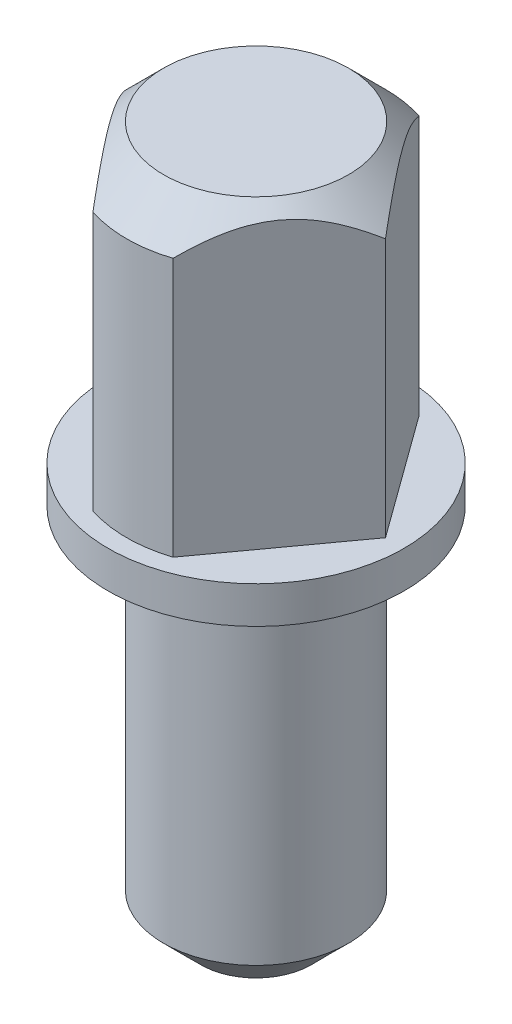
ISO-10303-21;
HEADER;
FILE_DESCRIPTION(('STEP AP214'),'2;1');
FILE_NAME('part.step','',(''),(''),'','','');
FILE_SCHEMA(('AUTOMOTIVE_DESIGN { 1 0 10303 214 1 1 1 1 }'));
ENDSEC;
DATA;
#1=APPLICATION_CONTEXT('core data for automotive mechanical design processes');
#2=APPLICATION_PROTOCOL_DEFINITION('international standard','automotive_design',2000,#1);
#3=PRODUCT_CONTEXT('',#1,'mechanical');
#4=PRODUCT('Part','Part','',(#3));
#5=PRODUCT_RELATED_PRODUCT_CATEGORY('part','',(#4));
#6=PRODUCT_DEFINITION_FORMATION('','',#4);
#7=PRODUCT_DEFINITION_CONTEXT('part definition',#1,'design');
#8=PRODUCT_DEFINITION('design','',#6,#7);
#9=PRODUCT_DEFINITION_SHAPE('','',#8);
#10=(LENGTH_UNIT() NAMED_UNIT(*) SI_UNIT(.MILLI.,.METRE.));
#11=(NAMED_UNIT(*) PLANE_ANGLE_UNIT() SI_UNIT($,.RADIAN.));
#12=(NAMED_UNIT(*) SI_UNIT($,.STERADIAN.) SOLID_ANGLE_UNIT());
#13=UNCERTAINTY_MEASURE_WITH_UNIT(LENGTH_MEASURE(1.E-05),#10,'distance_accuracy_value','');
#14=(GEOMETRIC_REPRESENTATION_CONTEXT(3) GLOBAL_UNCERTAINTY_ASSIGNED_CONTEXT((#13)) GLOBAL_UNIT_ASSIGNED_CONTEXT((#10,
#11,#12)) REPRESENTATION_CONTEXT('',''));
#15=CARTESIAN_POINT('',(0.,0.,0.));
#16=DIRECTION('',(0.,0.,1.));
#17=DIRECTION('',(1.,0.,0.));
#18=AXIS2_PLACEMENT_3D('',#15,#16,#17);
#19=CARTESIAN_POINT('',(0.,18.,0.));
#20=DIRECTION('',(0.,-1.,0.));
#21=DIRECTION('',(0.,0.,-1.));
#22=AXIS2_PLACEMENT_3D('',#19,#20,#21);
#23=CONICAL_SURFACE('',#22,3.5,0.785398163397448);
#24=CARTESIAN_POINT('',(0.,19.,0.));
#25=DIRECTION('',(0.,-1.,0.));
#26=DIRECTION('',(0.,0.,-1.));
#27=AXIS2_PLACEMENT_3D('',#24,#25,#26);
#28=CIRCLE('',#27,2.5);
#29=CARTESIAN_POINT('',(0.,19.,-2.5));
#30=VERTEX_POINT('',#29);
#31=EDGE_CURVE('E11',#30,#30,#28,.T.);
#32=ORIENTED_EDGE('',*,*,#31,.T.);
#33=EDGE_LOOP('',(#32));
#34=FACE_BOUND('',#33,.T.);
#35=CARTESIAN_POINT('',(0.,18.,0.));
#36=DIRECTION('',(0.,-1.,0.));
#37=DIRECTION('',(0.,0.,-1.));
#38=AXIS2_PLACEMENT_3D('',#35,#36,#37);
#39=CIRCLE('',#38,3.5);
#40=CARTESIAN_POINT('',(-1.0838503128378,18.,-3.32795259872514));
#41=VERTEX_POINT('',#40);
#42=CARTESIAN_POINT('',(1.0838503128378,18.,-3.32795259872514));
#43=VERTEX_POINT('',#42);
#44=EDGE_CURVE('E164',#41,#43,#39,.T.);
#45=ORIENTED_EDGE('',*,*,#44,.F.);
#46=CARTESIAN_POINT('',(-1.08365032367699,17.9998,-3.32822805949273));
#47=CARTESIAN_POINT('',(-1.11402671820043,18.030176357857,-3.28638826718544));
#48=CARTESIAN_POINT('',(-1.14459355594848,18.0600000576309,-3.24428616247772));
#49=CARTESIAN_POINT('',(-1.20615098634006,18.1183831901649,-3.15949828218579));
#50=CARTESIAN_POINT('',(-1.23714168574156,18.1469422964405,-3.11681235955545));
#51=CARTESIAN_POINT('',(-1.33103028730438,18.230675096118,-2.98749221965607));
#52=CARTESIAN_POINT('',(-1.39461173325774,18.2836681541312,-2.89991650387344));
#53=CARTESIAN_POINT('',(-1.52481008307131,18.3828455712695,-2.7205840978913));
#54=CARTESIAN_POINT('',(-1.59145903350211,18.4289094633328,-2.6287832674349));
#55=CARTESIAN_POINT('',(-1.72683225313013,18.5107954289209,-2.44232310710105));
#56=CARTESIAN_POINT('',(-1.79555308134463,18.5466335500756,-2.34766851675916));
#57=CARTESIAN_POINT('',(-1.9138220505311,18.5966405651253,-2.18476738300741));
#58=CARTESIAN_POINT('',(-1.96289168610165,18.6140849866464,-2.11717992264302));
#59=CARTESIAN_POINT('',(-2.06172783818495,18.6419607201251,-1.98104513309697));
#60=CARTESIAN_POINT('',(-2.11149436899897,18.6523918879448,-1.91249778421702));
#61=CARTESIAN_POINT('',(-2.21096761842672,18.6656280350204,-1.77548547049505));
#62=CARTESIAN_POINT('',(-2.26067144186041,18.6684952340286,-1.70702449341171));
#63=CARTESIAN_POINT('',(-2.36002762937955,18.6666229438029,-1.57017341824422));
#64=CARTESIAN_POINT('',(-2.40967999452048,18.6618836138081,-1.50178331870628));
#65=CARTESIAN_POINT('',(-2.5084002871059,18.6450860663779,-1.36580811154002));
#66=CARTESIAN_POINT('',(-2.55746951812905,18.6330497749663,-1.29822120839052));
#67=CARTESIAN_POINT('',(-2.65486740196593,18.6022887739095,-1.16406745858457));
#68=CARTESIAN_POINT('',(-2.70319597497211,18.5835633487067,-1.09750072185334));
#69=CARTESIAN_POINT('',(-2.84747314260307,18.5182406027486,-0.898776455097289));
#70=CARTESIAN_POINT('',(-2.94203464472195,18.4626310893466,-0.768529476448589));
#71=CARTESIAN_POINT('',(-3.07497981712026,18.3704275830071,-0.585413656132604));
#72=CARTESIAN_POINT('',(-3.11511985862376,18.3406664105703,-0.53012562652736));
#73=CARTESIAN_POINT('',(-3.1946539651854,18.2783398341906,-0.420577059223999));
#74=CARTESIAN_POINT('',(-3.23404799847801,18.2457743111626,-0.366316565279024));
#75=CARTESIAN_POINT('',(-3.31159194072944,18.1787363797435,-0.25950920748071));
#76=CARTESIAN_POINT('',(-3.34975148210584,18.1442959064636,-0.206949076142614));
#77=CARTESIAN_POINT('',(-3.42541823684559,18.073460794432,-0.102727316037591));
#78=CARTESIAN_POINT('',(-3.46292573434717,18.037067036627,-0.0510652959047807));
#79=CARTESIAN_POINT('',(-3.50014520337147,17.9998547909145,0.000199999999999133));
#80=B_SPLINE_CURVE_WITH_KNOTS('',3,(#46,#47,#48,#49,#50,#51,#52,#53,#54,#55,#56,#57,#58,#59,#60,
#61,#62,#63,#64,#65,#66,#67,#68,#69,#70,#71,#72,#73,#74,#75,#76,#77,#78,#79),.UNSPECIFIED.,.F.,
.F.,(4,2,2,2,2,2,2,2,2,2,2,2,2,2,2,2,4),(0.,0.179893726946961,0.35983363009338,
0.721096328039957,1.0880525124209,1.45442961293632,1.71014372990977,1.96586310221305,
2.21947232080014,2.47307623026548,2.72592185782533,2.97879454118124,3.48799252225676,
3.71154163700335,3.93510024931077,4.15562021370233,4.3760415442346),.UNSPECIFIED.);
#81=CARTESIAN_POINT('',(-3.5,18.,0.));
#82=VERTEX_POINT('',#81);
#83=EDGE_CURVE('E178',#41,#82,#80,.T.);
#84=ORIENTED_EDGE('',*,*,#83,.T.);
#85=CARTESIAN_POINT('',(-3.50014520337147,17.9998547909145,-0.000199999999999552));
#86=CARTESIAN_POINT('',(-3.46976917038442,18.0302298853187,0.0416392943348437));
#87=CARTESIAN_POINT('',(-3.43920269245051,18.0600523001882,0.0837409034423182));
#88=CARTESIAN_POINT('',(-3.37764597959783,18.1184328159192,0.168527795411605));
#89=CARTESIAN_POINT('',(-3.34665563791303,18.1469905902605,0.211213225330655));
#90=CARTESIAN_POINT('',(-3.2527681083358,18.230719310099,0.340531888700142));
#91=CARTESIAN_POINT('',(-3.18918737682792,18.2837095416669,0.428106620420938));
#92=CARTESIAN_POINT('',(-3.05899069461434,18.3828808807531,0.607436729486728));
#93=CARTESIAN_POINT('',(-2.99234270399167,18.4289415404428,0.699236237924062));
#94=CARTESIAN_POINT('',(-2.85697151581384,18.5108208980495,0.885693600182132));
#95=CARTESIAN_POINT('',(-2.78825175914587,18.5466556441986,0.980346714598868));
#96=CARTESIAN_POINT('',(-2.66998380031396,18.5966573612182,1.14324645670998));
#97=CARTESIAN_POINT('',(-2.62091403752326,18.6140997287698,1.21083409230467));
#98=CARTESIAN_POINT('',(-2.52207772015824,18.6419711770728,1.34696910950623));
#99=CARTESIAN_POINT('',(-2.47231115127602,18.6524001135976,1.41551651082048));
#100=CARTESIAN_POINT('',(-2.37283791139977,18.6656317458405,1.55252881138641));
#101=CARTESIAN_POINT('',(-2.32313413440752,18.6684966572558,1.62098972450232));
#102=CARTESIAN_POINT('',(-2.22377816016952,18.6666198363976,1.75784050590095));
#103=CARTESIAN_POINT('',(-2.17412596186682,18.6618782632029,1.82623037563952));
#104=CARTESIAN_POINT('',(-2.07540619869302,18.6450764159923,1.96220485360558));
#105=CARTESIAN_POINT('',(-2.02633732912341,18.6330380810804,2.02979125889676));
#106=CARTESIAN_POINT('',(-1.92894023605284,18.6022732575745,2.1639439195182));
#107=CARTESIAN_POINT('',(-1.88061209235966,18.5835460535138,2.23051006492295));
#108=CARTESIAN_POINT('',(-1.73633628349655,18.5182184012655,2.4292324601414));
#109=CARTESIAN_POINT('',(-1.64177576259625,18.4626062183854,2.55947808728073));
#110=CARTESIAN_POINT('',(-1.50883010552235,18.370398335446,2.74259457517845));
#111=CARTESIAN_POINT('',(-1.46868867439683,18.3406348977689,2.79788451881916));
#112=CARTESIAN_POINT('',(-1.38915183530266,18.2783037250935,2.90743684985404));
#113=CARTESIAN_POINT('',(-1.34975645912268,18.2457358709283,2.96169919346319));
#114=CARTESIAN_POINT('',(-1.27220989398372,18.1786932798204,3.06851016397037));
#115=CARTESIAN_POINT('',(-1.23404907196244,18.1442504789972,3.12107205924117));
#116=CARTESIAN_POINT('',(-1.15837978468645,18.0734106947299,3.22529730760713));
#117=CARTESIAN_POINT('',(-1.12087103525992,18.0370145923077,3.27696105211443));
#118=CARTESIAN_POINT('',(-1.08365032367699,17.9998,3.32822805949273));
#119=B_SPLINE_CURVE_WITH_KNOTS('',3,(#85,#86,#87,#88,#89,#90,#91,#92,#93,#94,#95,#96,#97,#98,
#99,#100,#101,#102,#103,#104,#105,#106,#107,#108,#109,#110,#111,#112,#113,#114,#115,#116,#117,
#118),.UNSPECIFIED.,.F.,.F.,(4,2,2,2,2,2,2,2,2,2,2,2,2,2,2,2,4),(0.,0.179890214712517,
0.359826608032367,0.721082283619987,1.08803025996694,1.45439915201837,1.71011263032279,
1.96583136705195,2.21944011442345,2.47304355799737,2.72588825098435,2.97875999729758,
3.48795602073635,3.71151435191345,3.93508218735297,4.15561120043553,4.37604156812719),.UNSPECIFIED.);
#120=CARTESIAN_POINT('',(-1.0838503128378,18.,3.32795259872514));
#121=VERTEX_POINT('',#120);
#122=EDGE_CURVE('E177',#82,#121,#119,.T.);
#123=ORIENTED_EDGE('',*,*,#122,.T.);
#124=CARTESIAN_POINT('',(1.0838503128378,18.,3.32795259872514));
#125=VERTEX_POINT('',#124);
#126=EDGE_CURVE('E40',#125,#121,#39,.T.);
#127=ORIENTED_EDGE('',*,*,#126,.F.);
#128=CARTESIAN_POINT('',(1.08365032367699,17.9998,3.32822805949273));
#129=CARTESIAN_POINT('',(1.11402671820043,18.030176357857,3.28638826718544));
#130=CARTESIAN_POINT('',(1.14459355594848,18.0600000576309,3.24428616247772));
#131=CARTESIAN_POINT('',(1.20615098634006,18.1183831901649,3.15949828218579));
#132=CARTESIAN_POINT('',(1.23714168574156,18.1469422964405,3.11681235955545));
#133=CARTESIAN_POINT('',(1.33103028730438,18.230675096118,2.98749221965607));
#134=CARTESIAN_POINT('',(1.39461173325774,18.2836681541312,2.89991650387344));
#135=CARTESIAN_POINT('',(1.52481008307131,18.3828455712695,2.7205840978913));
#136=CARTESIAN_POINT('',(1.59145903350211,18.4289094633328,2.6287832674349));
#137=CARTESIAN_POINT('',(1.72683225313013,18.5107954289209,2.44232310710105));
#138=CARTESIAN_POINT('',(1.79555308134463,18.5466335500756,2.34766851675916));
#139=CARTESIAN_POINT('',(1.9138220505311,18.5966405651253,2.18476738300741));
#140=CARTESIAN_POINT('',(1.96289168610165,18.6140849866464,2.11717992264302));
#141=CARTESIAN_POINT('',(2.06172783818495,18.6419607201251,1.98104513309697));
#142=CARTESIAN_POINT('',(2.11149436899897,18.6523918879448,1.91249778421702));
#143=CARTESIAN_POINT('',(2.21096761842672,18.6656280350204,1.77548547049505));
#144=CARTESIAN_POINT('',(2.26067144186041,18.6684952340286,1.70702449341171));
#145=CARTESIAN_POINT('',(2.36002762937955,18.6666229438029,1.57017341824422));
#146=CARTESIAN_POINT('',(2.40967999452048,18.6618836138081,1.50178331870628));
#147=CARTESIAN_POINT('',(2.5084002871059,18.6450860663779,1.36580811154002));
#148=CARTESIAN_POINT('',(2.55746951812905,18.6330497749663,1.29822120839052));
#149=CARTESIAN_POINT('',(2.65486740196593,18.6022887739095,1.16406745858457));
#150=CARTESIAN_POINT('',(2.70319597497211,18.5835633487067,1.09750072185334));
#151=CARTESIAN_POINT('',(2.84747314260307,18.5182406027486,0.898776455097287));
#152=CARTESIAN_POINT('',(2.94203464472195,18.4626310893466,0.768529476448588));
#153=CARTESIAN_POINT('',(3.07497981712026,18.3704275830071,0.585413656132604));
#154=CARTESIAN_POINT('',(3.11511985862376,18.3406664105703,0.53012562652736));
#155=CARTESIAN_POINT('',(3.1946539651854,18.2783398341906,0.420577059223999));
#156=CARTESIAN_POINT('',(3.23404799847801,18.2457743111626,0.366316565279024));
#157=CARTESIAN_POINT('',(3.31159194072944,18.1787363797435,0.259509207480709));
#158=CARTESIAN_POINT('',(3.34975148210584,18.1442959064636,0.206949076142613));
#159=CARTESIAN_POINT('',(3.42541823684559,18.073460794432,0.102727316037591));
#160=CARTESIAN_POINT('',(3.46292573434717,18.037067036627,0.0510652959047807));
#161=CARTESIAN_POINT('',(3.50014520337147,17.9998547909145,-0.000199999999999083));
#162=B_SPLINE_CURVE_WITH_KNOTS('',3,(#128,#129,#130,#131,#132,#133,#134,#135,#136,#137,#138,
#139,#140,#141,#142,#143,#144,#145,#146,#147,#148,#149,#150,#151,#152,#153,#154,#155,#156,#157,
#158,#159,#160,#161),.UNSPECIFIED.,.F.,.F.,(4,2,2,2,2,2,2,2,2,2,2,2,2,2,2,2,4),(0.,
0.179893726946961,0.359833630093378,0.721096328039957,1.0880525124209,1.45442961293632,
1.71014372990977,1.96586310221305,2.21947232080014,2.47307623026548,2.72592185782533,
2.97879454118124,3.48799252225676,3.71154163700335,3.93510024931077,4.15562021370233,
4.3760415442346),.UNSPECIFIED.);
#163=CARTESIAN_POINT('',(3.5,18.,0.));
#164=VERTEX_POINT('',#163);
#165=EDGE_CURVE('E175',#125,#164,#162,.T.);
#166=ORIENTED_EDGE('',*,*,#165,.T.);
#167=CARTESIAN_POINT('',(3.50014520337147,17.9998547909145,0.000199999999999693));
#168=CARTESIAN_POINT('',(3.46976917038442,18.0302298853187,-0.0416392943348438));
#169=CARTESIAN_POINT('',(3.43920269245051,18.0600523001882,-0.0837409034423184));
#170=CARTESIAN_POINT('',(3.37764597959783,18.1184328159192,-0.168527795411605));
#171=CARTESIAN_POINT('',(3.34665563791303,18.1469905902605,-0.211213225330656));
#172=CARTESIAN_POINT('',(3.2527681083358,18.230719310099,-0.340531888700142));
#173=CARTESIAN_POINT('',(3.18918737682792,18.2837095416669,-0.428106620420938));
#174=CARTESIAN_POINT('',(3.05899069461434,18.3828808807531,-0.607436729486728));
#175=CARTESIAN_POINT('',(2.99234270399167,18.4289415404428,-0.699236237924062));
#176=CARTESIAN_POINT('',(2.85697151581384,18.5108208980495,-0.885693600182132));
#177=CARTESIAN_POINT('',(2.78825175914587,18.5466556441986,-0.980346714598867));
#178=CARTESIAN_POINT('',(2.66998380031396,18.5966573612182,-1.14324645670998));
#179=CARTESIAN_POINT('',(2.62091403752326,18.6140997287698,-1.21083409230467));
#180=CARTESIAN_POINT('',(2.52207772015824,18.6419711770728,-1.34696910950622));
#181=CARTESIAN_POINT('',(2.47231115127602,18.6524001135976,-1.41551651082047));
#182=CARTESIAN_POINT('',(2.37283791139977,18.6656317458405,-1.55252881138641));
#183=CARTESIAN_POINT('',(2.32313413440752,18.6684966572558,-1.62098972450232));
#184=CARTESIAN_POINT('',(2.22377816016952,18.6666198363976,-1.75784050590095));
#185=CARTESIAN_POINT('',(2.17412596186682,18.6618782632029,-1.82623037563952));
#186=CARTESIAN_POINT('',(2.07540619869302,18.6450764159923,-1.96220485360558));
#187=CARTESIAN_POINT('',(2.02633732912341,18.6330380810804,-2.02979125889676));
#188=CARTESIAN_POINT('',(1.92894023605284,18.6022732575745,-2.1639439195182));
#189=CARTESIAN_POINT('',(1.88061209235966,18.5835460535138,-2.23051006492295));
#190=CARTESIAN_POINT('',(1.73633628349655,18.5182184012655,-2.4292324601414));
#191=CARTESIAN_POINT('',(1.64177576259625,18.4626062183854,-2.55947808728073));
#192=CARTESIAN_POINT('',(1.50883010552235,18.370398335446,-2.74259457517845));
#193=CARTESIAN_POINT('',(1.46868867439683,18.3406348977689,-2.79788451881916));
#194=CARTESIAN_POINT('',(1.38915183530266,18.2783037250935,-2.90743684985404));
#195=CARTESIAN_POINT('',(1.34975645912268,18.2457358709283,-2.96169919346319));
#196=CARTESIAN_POINT('',(1.27220989398372,18.1786932798204,-3.06851016397037));
#197=CARTESIAN_POINT('',(1.23404907196244,18.1442504789972,-3.12107205924117));
#198=CARTESIAN_POINT('',(1.15837978468645,18.0734106947299,-3.22529730760713));
#199=CARTESIAN_POINT('',(1.12087103525992,18.0370145923077,-3.27696105211443));
#200=CARTESIAN_POINT('',(1.08365032367699,17.9998,-3.32822805949273));
#201=B_SPLINE_CURVE_WITH_KNOTS('',3,(#167,#168,#169,#170,#171,#172,#173,#174,#175,#176,#177,
#178,#179,#180,#181,#182,#183,#184,#185,#186,#187,#188,#189,#190,#191,#192,#193,#194,#195,#196,
#197,#198,#199,#200),.UNSPECIFIED.,.F.,.F.,(4,2,2,2,2,2,2,2,2,2,2,2,2,2,2,2,4),(0.,
0.179890214712517,0.359826608032366,0.721082283619987,1.08803025996694,1.45439915201836,
1.71011263032278,1.96583136705194,2.21944011442345,2.47304355799737,2.72588825098435,
2.97875999729757,3.48795602073635,3.71151435191345,3.93508218735297,4.15561120043553,
4.37604156812719),.UNSPECIFIED.);
#202=EDGE_CURVE('E104',#164,#43,#201,.T.);
#203=ORIENTED_EDGE('',*,*,#202,.T.);
#204=EDGE_LOOP('',(#45,#84,#123,#127,#166,#203));
#205=FACE_BOUND('',#204,.T.);
#206=ADVANCED_FACE('F32',(#34,#205),#23,.T.);
#207=CARTESIAN_POINT('',(0.,0.,0.));
#208=DIRECTION('',(0.,-1.,0.));
#209=DIRECTION('',(0.,0.,-1.));
#210=AXIS2_PLACEMENT_3D('',#207,#208,#209);
#211=CYLINDRICAL_SURFACE('',#210,3.5);
#212=CARTESIAN_POINT('',(0.,11.,0.));
#213=DIRECTION('',(0.,-1.,0.));
#214=DIRECTION('',(0.,0.,-1.));
#215=AXIS2_PLACEMENT_3D('',#212,#213,#214);
#216=CIRCLE('',#215,3.5);
#217=CARTESIAN_POINT('',(-1.0838503128378,11.,-3.32795259872514));
#218=VERTEX_POINT('',#217);
#219=CARTESIAN_POINT('',(1.0838503128378,11.,-3.32795259872514));
#220=VERTEX_POINT('',#219);
#221=EDGE_CURVE('E87',#218,#220,#216,.T.);
#222=ORIENTED_EDGE('',*,*,#221,.F.);
#223=DIRECTION('',(0.,-1.,0.));
#224=VECTOR('',#223,1.);
#225=CARTESIAN_POINT('',(-1.0838503128378,0.,-3.32795259872514));
#226=LINE('',#225,#224);
#227=EDGE_CURVE('E159',#218,#41,#226,.F.);
#228=ORIENTED_EDGE('',*,*,#227,.T.);
#229=ORIENTED_EDGE('',*,*,#44,.T.);
#230=DIRECTION('',(0.,-1.,0.));
#231=VECTOR('',#230,1.);
#232=CARTESIAN_POINT('',(1.0838503128378,0.,-3.32795259872514));
#233=LINE('',#232,#231);
#234=EDGE_CURVE('E111',#43,#220,#233,.T.);
#235=ORIENTED_EDGE('',*,*,#234,.T.);
#236=EDGE_LOOP('',(#222,#228,#229,#235));
#237=FACE_BOUND('',#236,.T.);
#238=ADVANCED_FACE('F147',(#237),#211,.T.);
#239=ORIENTED_EDGE('',*,*,#126,.T.);
#240=DIRECTION('',(0.,-1.,0.));
#241=VECTOR('',#240,1.);
#242=CARTESIAN_POINT('',(-1.0838503128378,0.,3.32795259872514));
#243=LINE('',#242,#241);
#244=CARTESIAN_POINT('',(-1.0838503128378,11.,3.32795259872514));
#245=VERTEX_POINT('',#244);
#246=EDGE_CURVE('E172',#121,#245,#243,.T.);
#247=ORIENTED_EDGE('',*,*,#246,.T.);
#248=CARTESIAN_POINT('',(1.0838503128378,11.,3.32795259872514));
#249=VERTEX_POINT('',#248);
#250=EDGE_CURVE('E161',#249,#245,#216,.T.);
#251=ORIENTED_EDGE('',*,*,#250,.F.);
#252=DIRECTION('',(0.,-1.,0.));
#253=VECTOR('',#252,1.);
#254=CARTESIAN_POINT('',(1.0838503128378,0.,3.32795259872514));
#255=LINE('',#254,#253);
#256=EDGE_CURVE('E98',#249,#125,#255,.F.);
#257=ORIENTED_EDGE('',*,*,#256,.T.);
#258=EDGE_LOOP('',(#239,#247,#251,#257));
#259=FACE_BOUND('',#258,.T.);
#260=ADVANCED_FACE('F149',(#259),#211,.T.);
#261=CARTESIAN_POINT('',(1.5,0.,0.));
#262=DIRECTION('',(0.,-1.,0.));
#263=DIRECTION('',(0.,0.,-1.));
#264=AXIS2_PLACEMENT_3D('',#261,#262,#263);
#265=PLANE('',#264);
#266=CARTESIAN_POINT('',(0.,0.,0.));
#267=DIRECTION('',(0.,-1.,0.));
#268=DIRECTION('',(0.,0.,-1.));
#269=AXIS2_PLACEMENT_3D('',#266,#267,#268);
#270=CIRCLE('',#269,1.5);
#271=CARTESIAN_POINT('',(0.,0.,-1.5));
#272=VERTEX_POINT('',#271);
#273=EDGE_CURVE('E203',#272,#272,#270,.T.);
#274=ORIENTED_EDGE('',*,*,#273,.T.);
#275=EDGE_LOOP('',(#274));
#276=FACE_BOUND('',#275,.T.);
#277=ADVANCED_FACE('F34',(#276),#265,.T.);
#278=CARTESIAN_POINT('',(0.,19.,0.));
#279=DIRECTION('',(0.,1.,0.));
#280=DIRECTION('',(0.,0.,1.));
#281=AXIS2_PLACEMENT_3D('',#278,#279,#280);
#282=PLANE('',#281);
#283=ORIENTED_EDGE('',*,*,#31,.F.);
#284=EDGE_LOOP('',(#283));
#285=FACE_BOUND('',#284,.T.);
#286=ADVANCED_FACE('F146',(#285),#282,.T.);
#287=CARTESIAN_POINT('',(3.5,11.,0.));
#288=DIRECTION('',(0.,1.,0.));
#289=DIRECTION('',(0.,0.,1.));
#290=AXIS2_PLACEMENT_3D('',#287,#288,#289);
#291=PLANE('',#290);
#292=ORIENTED_EDGE('',*,*,#250,.T.);
#293=DIRECTION('',(-0.587506800831421,0.,-0.809219228007361));
#294=VECTOR('',#293,1.);
#295=CARTESIAN_POINT('',(-3.5,11.,0.));
#296=LINE('',#295,#294);
#297=CARTESIAN_POINT('',(-3.5,11.,0.));
#298=VERTEX_POINT('',#297);
#299=EDGE_CURVE('E100',#245,#298,#296,.T.);
#300=ORIENTED_EDGE('',*,*,#299,.T.);
#301=DIRECTION('',(0.587506800831421,0.,-0.809219228007361));
#302=VECTOR('',#301,1.);
#303=CARTESIAN_POINT('',(0.,11.,-4.82082470197388));
#304=LINE('',#303,#302);
#305=EDGE_CURVE('E47',#298,#218,#304,.T.);
#306=ORIENTED_EDGE('',*,*,#305,.T.);
#307=ORIENTED_EDGE('',*,*,#221,.T.);
#308=DIRECTION('',(0.587506800831421,0.,0.809219228007361));
#309=VECTOR('',#308,1.);
#310=CARTESIAN_POINT('',(0.,11.,-4.82082470197388));
#311=LINE('',#310,#309);
#312=CARTESIAN_POINT('',(3.5,11.,0.));
#313=VERTEX_POINT('',#312);
#314=EDGE_CURVE('E83',#220,#313,#311,.T.);
#315=ORIENTED_EDGE('',*,*,#314,.T.);
#316=DIRECTION('',(-0.587506800831421,0.,0.809219228007361));
#317=VECTOR('',#316,1.);
#318=CARTESIAN_POINT('',(3.5,11.,0.));
#319=LINE('',#318,#317);
#320=EDGE_CURVE('E54',#313,#249,#319,.T.);
#321=ORIENTED_EDGE('',*,*,#320,.T.);
#322=EDGE_LOOP('',(#292,#300,#306,#307,#315,#321));
#323=FACE_BOUND('',#322,.T.);
#324=CARTESIAN_POINT('',(0.,11.,0.));
#325=DIRECTION('',(0.,-1.,0.));
#326=DIRECTION('',(0.,0.,-1.));
#327=AXIS2_PLACEMENT_3D('',#324,#325,#326);
#328=CIRCLE('',#327,4.);
#329=CARTESIAN_POINT('',(0.,11.,-4.));
#330=VERTEX_POINT('',#329);
#331=EDGE_CURVE('E162',#330,#330,#328,.T.);
#332=ORIENTED_EDGE('',*,*,#331,.F.);
#333=EDGE_LOOP('',(#332));
#334=FACE_BOUND('',#333,.T.);
#335=ADVANCED_FACE('F84',(#323,#334),#291,.T.);
#336=CARTESIAN_POINT('',(0.,0.,0.));
#337=DIRECTION('',(0.,-1.,0.));
#338=DIRECTION('',(0.,0.,-1.));
#339=AXIS2_PLACEMENT_3D('',#336,#337,#338);
#340=CYLINDRICAL_SURFACE('',#339,4.);
#341=ORIENTED_EDGE('',*,*,#331,.T.);
#342=EDGE_LOOP('',(#341));
#343=FACE_BOUND('',#342,.T.);
#344=CARTESIAN_POINT('',(0.,10.,0.));
#345=DIRECTION('',(0.,-1.,0.));
#346=DIRECTION('',(0.,0.,-1.));
#347=AXIS2_PLACEMENT_3D('',#344,#345,#346);
#348=CIRCLE('',#347,4.);
#349=CARTESIAN_POINT('',(0.,10.,-4.));
#350=VERTEX_POINT('',#349);
#351=EDGE_CURVE('E166',#350,#350,#348,.T.);
#352=ORIENTED_EDGE('',*,*,#351,.F.);
#353=EDGE_LOOP('',(#352));
#354=FACE_BOUND('',#353,.T.);
#355=ADVANCED_FACE('F140',(#343,#354),#340,.T.);
#356=CARTESIAN_POINT('',(4.,10.,0.));
#357=DIRECTION('',(0.,-1.,0.));
#358=DIRECTION('',(0.,0.,-1.));
#359=AXIS2_PLACEMENT_3D('',#356,#357,#358);
#360=PLANE('',#359);
#361=ORIENTED_EDGE('',*,*,#351,.T.);
#362=EDGE_LOOP('',(#361));
#363=FACE_BOUND('',#362,.T.);
#364=CARTESIAN_POINT('',(0.,10.,0.));
#365=DIRECTION('',(0.,-1.,0.));
#366=DIRECTION('',(0.,0.,-1.));
#367=AXIS2_PLACEMENT_3D('',#364,#365,#366);
#368=CIRCLE('',#367,2.5);
#369=CARTESIAN_POINT('',(0.,10.,-2.5));
#370=VERTEX_POINT('',#369);
#371=EDGE_CURVE('E213',#370,#370,#368,.T.);
#372=ORIENTED_EDGE('',*,*,#371,.F.);
#373=EDGE_LOOP('',(#372));
#374=FACE_BOUND('',#373,.T.);
#375=ADVANCED_FACE('F136',(#363,#374),#360,.T.);
#376=CARTESIAN_POINT('',(0.,0.,0.));
#377=DIRECTION('',(0.,-1.,0.));
#378=DIRECTION('',(0.,0.,-1.));
#379=AXIS2_PLACEMENT_3D('',#376,#377,#378);
#380=CYLINDRICAL_SURFACE('',#379,2.5);
#381=ORIENTED_EDGE('',*,*,#371,.T.);
#382=EDGE_LOOP('',(#381));
#383=FACE_BOUND('',#382,.T.);
#384=CARTESIAN_POINT('',(0.,0.999999999999997,0.));
#385=DIRECTION('',(0.,-1.,0.));
#386=DIRECTION('',(0.,0.,-1.));
#387=AXIS2_PLACEMENT_3D('',#384,#385,#386);
#388=CIRCLE('',#387,2.5);
#389=CARTESIAN_POINT('',(0.,0.999999999999997,-2.5));
#390=VERTEX_POINT('',#389);
#391=EDGE_CURVE('E205',#390,#390,#388,.T.);
#392=ORIENTED_EDGE('',*,*,#391,.F.);
#393=EDGE_LOOP('',(#392));
#394=FACE_BOUND('',#393,.T.);
#395=ADVANCED_FACE('F132',(#383,#394),#380,.T.);
#396=CARTESIAN_POINT('',(0.,0.,0.));
#397=DIRECTION('',(0.,1.,0.));
#398=DIRECTION('',(0.,0.,1.));
#399=AXIS2_PLACEMENT_3D('',#396,#397,#398);
#400=CONICAL_SURFACE('',#399,1.5,0.785398163397449);
#401=ORIENTED_EDGE('',*,*,#391,.T.);
#402=EDGE_LOOP('',(#401));
#403=FACE_BOUND('',#402,.T.);
#404=ORIENTED_EDGE('',*,*,#273,.F.);
#405=EDGE_LOOP('',(#404));
#406=FACE_BOUND('',#405,.T.);
#407=ADVANCED_FACE('F126',(#403,#406),#400,.T.);
#408=CARTESIAN_POINT('',(0.,-6.77006800174138,-4.82082470197388));
#409=DIRECTION('',(0.809219228007361,0.,-0.587506800831421));
#410=DIRECTION('',(-0.587506800831421,0.,-0.809219228007361));
#411=AXIS2_PLACEMENT_3D('',#408,#409,#410);
#412=PLANE('',#411);
#413=DIRECTION('',(0.,1.,0.));
#414=VECTOR('',#413,1.);
#415=CARTESIAN_POINT('',(3.5,-6.77006800174138,0.));
#416=LINE('',#415,#414);
#417=EDGE_CURVE('E95',#313,#164,#416,.T.);
#418=ORIENTED_EDGE('',*,*,#417,.F.);
#419=ORIENTED_EDGE('',*,*,#314,.F.);
#420=ORIENTED_EDGE('',*,*,#234,.F.);
#421=ORIENTED_EDGE('',*,*,#202,.F.);
#422=EDGE_LOOP('',(#418,#419,#420,#421));
#423=FACE_BOUND('',#422,.T.);
#424=ADVANCED_FACE('F102',(#423),#412,.T.);
#425=CARTESIAN_POINT('',(3.5,-6.77006800174138,0.));
#426=DIRECTION('',(0.809219228007361,0.,0.587506800831421));
#427=DIRECTION('',(0.587506800831421,0.,-0.809219228007361));
#428=AXIS2_PLACEMENT_3D('',#425,#426,#427);
#429=PLANE('',#428);
#430=ORIENTED_EDGE('',*,*,#256,.F.);
#431=ORIENTED_EDGE('',*,*,#320,.F.);
#432=ORIENTED_EDGE('',*,*,#417,.T.);
#433=ORIENTED_EDGE('',*,*,#165,.F.);
#434=EDGE_LOOP('',(#430,#431,#432,#433));
#435=FACE_BOUND('',#434,.T.);
#436=ADVANCED_FACE('F94',(#435),#429,.T.);
#437=CARTESIAN_POINT('',(0.,-6.77006800174138,-4.82082470197388));
#438=DIRECTION('',(-0.809219228007361,0.,-0.587506800831421));
#439=DIRECTION('',(-0.587506800831421,0.,0.809219228007361));
#440=AXIS2_PLACEMENT_3D('',#437,#438,#439);
#441=PLANE('',#440);
#442=ORIENTED_EDGE('',*,*,#227,.F.);
#443=ORIENTED_EDGE('',*,*,#305,.F.);
#444=DIRECTION('',(0.,1.,0.));
#445=VECTOR('',#444,1.);
#446=CARTESIAN_POINT('',(-3.5,-6.77006800174138,0.));
#447=LINE('',#446,#445);
#448=EDGE_CURVE('E105',#298,#82,#447,.T.);
#449=ORIENTED_EDGE('',*,*,#448,.T.);
#450=ORIENTED_EDGE('',*,*,#83,.F.);
#451=EDGE_LOOP('',(#442,#443,#449,#450));
#452=FACE_BOUND('',#451,.T.);
#453=ADVANCED_FACE('F127',(#452),#441,.T.);
#454=CARTESIAN_POINT('',(-3.5,-6.77006800174138,0.));
#455=DIRECTION('',(-0.809219228007361,0.,0.587506800831421));
#456=DIRECTION('',(0.587506800831421,0.,0.809219228007361));
#457=AXIS2_PLACEMENT_3D('',#454,#455,#456);
#458=PLANE('',#457);
#459=ORIENTED_EDGE('',*,*,#448,.F.);
#460=ORIENTED_EDGE('',*,*,#299,.F.);
#461=ORIENTED_EDGE('',*,*,#246,.F.);
#462=ORIENTED_EDGE('',*,*,#122,.F.);
#463=EDGE_LOOP('',(#459,#460,#461,#462));
#464=FACE_BOUND('',#463,.T.);
#465=ADVANCED_FACE('F188',(#464),#458,.T.);
#466=CLOSED_SHELL('',(#206,#238,#260,#277,#286,#335,#355,#375,#395,#407,#424,#436,#453,#465));
#467=MANIFOLD_SOLID_BREP('B2',#466);
#468=ADVANCED_BREP_SHAPE_REPRESENTATION('',(#18,#467),#14);
#469=SHAPE_DEFINITION_REPRESENTATION(#9,#468);
ENDSEC;
END-ISO-10303-21;
